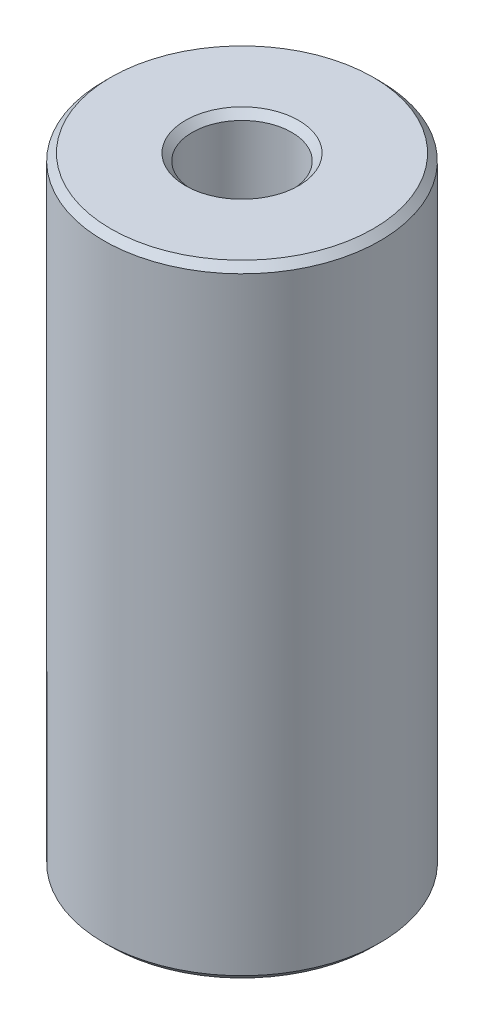
ISO-10303-21;
HEADER;
FILE_DESCRIPTION(('STEP AP214'),'2;1');
FILE_NAME('part.step','',(''),(''),'','','');
FILE_SCHEMA(('AUTOMOTIVE_DESIGN { 1 0 10303 214 1 1 1 1 }'));
ENDSEC;
DATA;
#1=APPLICATION_CONTEXT('core data for automotive mechanical design processes');
#2=APPLICATION_PROTOCOL_DEFINITION('international standard','automotive_design',2000,#1);
#3=PRODUCT_CONTEXT('',#1,'mechanical');
#4=PRODUCT('Part','Part','',(#3));
#5=PRODUCT_RELATED_PRODUCT_CATEGORY('part','',(#4));
#6=PRODUCT_DEFINITION_FORMATION('','',#4);
#7=PRODUCT_DEFINITION_CONTEXT('part definition',#1,'design');
#8=PRODUCT_DEFINITION('design','',#6,#7);
#9=PRODUCT_DEFINITION_SHAPE('','',#8);
#10=(LENGTH_UNIT() NAMED_UNIT(*) SI_UNIT(.MILLI.,.METRE.));
#11=(NAMED_UNIT(*) PLANE_ANGLE_UNIT() SI_UNIT($,.RADIAN.));
#12=(NAMED_UNIT(*) SI_UNIT($,.STERADIAN.) SOLID_ANGLE_UNIT());
#13=UNCERTAINTY_MEASURE_WITH_UNIT(LENGTH_MEASURE(1.E-05),#10,'distance_accuracy_value','');
#14=(GEOMETRIC_REPRESENTATION_CONTEXT(3) GLOBAL_UNCERTAINTY_ASSIGNED_CONTEXT((#13)) GLOBAL_UNIT_ASSIGNED_CONTEXT((#10,
#11,#12)) REPRESENTATION_CONTEXT('',''));
#15=CARTESIAN_POINT('',(0.,0.,0.));
#16=DIRECTION('',(0.,0.,1.));
#17=DIRECTION('',(1.,0.,0.));
#18=AXIS2_PLACEMENT_3D('',#15,#16,#17);
#19=CARTESIAN_POINT('',(0.,45.,0.));
#20=DIRECTION('',(0.,1.,0.));
#21=DIRECTION('',(0.,0.,1.));
#22=AXIS2_PLACEMENT_3D('',#19,#20,#21);
#23=PLANE('',#22);
#24=CARTESIAN_POINT('',(0.,45.,0.));
#25=DIRECTION('',(0.,1.,0.));
#26=DIRECTION('',(0.,0.,1.));
#27=AXIS2_PLACEMENT_3D('',#24,#25,#26);
#28=CIRCLE('',#27,4.10000000000003);
#29=CARTESIAN_POINT('',(0.,45.,4.10000000000003));
#30=VERTEX_POINT('',#29);
#31=EDGE_CURVE('E53',#30,#30,#28,.F.);
#32=ORIENTED_EDGE('',*,*,#31,.T.);
#33=EDGE_LOOP('',(#32));
#34=FACE_BOUND('',#33,.T.);
#35=CARTESIAN_POINT('',(0.,45.,0.));
#36=DIRECTION('',(0.,1.,0.));
#37=DIRECTION('',(0.,0.,1.));
#38=AXIS2_PLACEMENT_3D('',#35,#36,#37);
#39=CIRCLE('',#38,9.50000000000003);
#40=CARTESIAN_POINT('',(0.,45.,9.50000000000003));
#41=VERTEX_POINT('',#40);
#42=EDGE_CURVE('E57',#41,#41,#39,.T.);
#43=ORIENTED_EDGE('',*,*,#42,.T.);
#44=EDGE_LOOP('',(#43));
#45=FACE_BOUND('',#44,.T.);
#46=ADVANCED_FACE('F41',(#34,#45),#23,.T.);
#47=CARTESIAN_POINT('',(0.,0.,0.));
#48=DIRECTION('',(0.,1.,0.));
#49=DIRECTION('',(0.,0.,1.));
#50=AXIS2_PLACEMENT_3D('',#47,#48,#49);
#51=PLANE('',#50);
#52=CARTESIAN_POINT('',(0.,0.,0.));
#53=DIRECTION('',(0.,1.,0.));
#54=DIRECTION('',(0.,0.,1.));
#55=AXIS2_PLACEMENT_3D('',#52,#53,#54);
#56=CIRCLE('',#55,4.09999999999999);
#57=CARTESIAN_POINT('',(0.,0.,4.09999999999999));
#58=VERTEX_POINT('',#57);
#59=EDGE_CURVE('E68',#58,#58,#56,.T.);
#60=ORIENTED_EDGE('',*,*,#59,.T.);
#61=EDGE_LOOP('',(#60));
#62=FACE_BOUND('',#61,.T.);
#63=CARTESIAN_POINT('',(0.,0.,0.));
#64=DIRECTION('',(0.,1.,0.));
#65=DIRECTION('',(0.,0.,1.));
#66=AXIS2_PLACEMENT_3D('',#63,#64,#65);
#67=CIRCLE('',#66,9.49999999999996);
#68=CARTESIAN_POINT('',(0.,0.,9.49999999999996));
#69=VERTEX_POINT('',#68);
#70=EDGE_CURVE('E71',#69,#69,#67,.F.);
#71=ORIENTED_EDGE('',*,*,#70,.T.);
#72=EDGE_LOOP('',(#71));
#73=FACE_BOUND('',#72,.T.);
#74=ADVANCED_FACE('F75',(#62,#73),#51,.F.);
#75=CARTESIAN_POINT('',(0.,45.,0.));
#76=DIRECTION('',(0.,-1.,0.));
#77=DIRECTION('',(0.,0.,-1.));
#78=AXIS2_PLACEMENT_3D('',#75,#76,#77);
#79=CYLINDRICAL_SURFACE('',#78,10.);
#80=CARTESIAN_POINT('',(0.,44.5,0.));
#81=DIRECTION('',(0.,1.,0.));
#82=DIRECTION('',(0.,0.,1.));
#83=AXIS2_PLACEMENT_3D('',#80,#81,#82);
#84=CIRCLE('',#83,10.);
#85=CARTESIAN_POINT('',(0.,44.5,-10.));
#86=VERTEX_POINT('',#85);
#87=EDGE_CURVE('E10',#86,#86,#84,.F.);
#88=CARTESIAN_POINT('',(0.,0.500000000000035,0.));
#89=DIRECTION('',(0.,1.,0.));
#90=DIRECTION('',(0.,0.,1.));
#91=AXIS2_PLACEMENT_3D('',#88,#89,#90);
#92=CIRCLE('',#91,10.);
#93=CARTESIAN_POINT('',(0.,0.500000000000035,-10.));
#94=VERTEX_POINT('',#93);
#95=EDGE_CURVE('E49',#94,#94,#92,.T.);
#96=CARTESIAN_POINT('',(0.,44.5,-10.));
#97=CARTESIAN_POINT('',(0.,44.0416666666667,-10.));
#98=CARTESIAN_POINT('',(0.,43.5833333333334,-10.));
#99=CARTESIAN_POINT('',(0.,42.6666666666667,-10.));
#100=CARTESIAN_POINT('',(0.,42.2083333333334,-10.));
#101=CARTESIAN_POINT('',(0.,41.2916666666667,-10.));
#102=CARTESIAN_POINT('',(0.,40.8333333333334,-10.));
#103=CARTESIAN_POINT('',(0.,39.9166666666667,-10.));
#104=CARTESIAN_POINT('',(0.,39.4583333333334,-10.));
#105=CARTESIAN_POINT('',(0.,38.5416666666667,-10.));
#106=CARTESIAN_POINT('',(0.,38.0833333333334,-10.));
#107=CARTESIAN_POINT('',(0.,37.1666666666667,-10.));
#108=CARTESIAN_POINT('',(0.,36.7083333333334,-10.));
#109=CARTESIAN_POINT('',(0.,35.7916666666667,-10.));
#110=CARTESIAN_POINT('',(0.,35.3333333333334,-10.));
#111=CARTESIAN_POINT('',(0.,34.4166666666667,-10.));
#112=CARTESIAN_POINT('',(0.,33.9583333333334,-10.));
#113=CARTESIAN_POINT('',(0.,33.0416666666667,-10.));
#114=CARTESIAN_POINT('',(0.,32.5833333333334,-10.));
#115=CARTESIAN_POINT('',(0.,31.6666666666667,-10.));
#116=CARTESIAN_POINT('',(0.,31.2083333333334,-10.));
#117=CARTESIAN_POINT('',(0.,30.2916666666667,-10.));
#118=CARTESIAN_POINT('',(0.,29.8333333333334,-10.));
#119=CARTESIAN_POINT('',(0.,28.9166666666667,-10.));
#120=CARTESIAN_POINT('',(0.,28.4583333333334,-10.));
#121=CARTESIAN_POINT('',(0.,27.5416666666667,-10.));
#122=CARTESIAN_POINT('',(0.,27.0833333333334,-10.));
#123=CARTESIAN_POINT('',(0.,26.1666666666667,-10.));
#124=CARTESIAN_POINT('',(0.,25.7083333333334,-10.));
#125=CARTESIAN_POINT('',(0.,24.7916666666667,-10.));
#126=CARTESIAN_POINT('',(0.,24.3333333333334,-10.));
#127=CARTESIAN_POINT('',(0.,23.4166666666667,-10.));
#128=CARTESIAN_POINT('',(0.,22.9583333333334,-10.));
#129=CARTESIAN_POINT('',(0.,22.0416666666667,-10.));
#130=CARTESIAN_POINT('',(0.,21.5833333333334,-10.));
#131=CARTESIAN_POINT('',(0.,20.6666666666667,-10.));
#132=CARTESIAN_POINT('',(0.,20.2083333333334,-10.));
#133=CARTESIAN_POINT('',(0.,19.2916666666667,-10.));
#134=CARTESIAN_POINT('',(0.,18.8333333333334,-10.));
#135=CARTESIAN_POINT('',(0.,17.9166666666667,-10.));
#136=CARTESIAN_POINT('',(0.,17.4583333333334,-10.));
#137=CARTESIAN_POINT('',(0.,16.5416666666667,-10.));
#138=CARTESIAN_POINT('',(0.,16.0833333333334,-10.));
#139=CARTESIAN_POINT('',(0.,15.1666666666667,-10.));
#140=CARTESIAN_POINT('',(0.,14.7083333333334,-10.));
#141=CARTESIAN_POINT('',(0.,13.7916666666667,-10.));
#142=CARTESIAN_POINT('',(0.,13.3333333333334,-10.));
#143=CARTESIAN_POINT('',(0.,12.4166666666667,-10.));
#144=CARTESIAN_POINT('',(0.,11.9583333333334,-10.));
#145=CARTESIAN_POINT('',(0.,11.0416666666667,-10.));
#146=CARTESIAN_POINT('',(0.,10.5833333333334,-10.));
#147=CARTESIAN_POINT('',(0.,9.66666666666671,-10.));
#148=CARTESIAN_POINT('',(0.,9.20833333333337,-10.));
#149=CARTESIAN_POINT('',(0.,8.29166666666671,-10.));
#150=CARTESIAN_POINT('',(0.,7.83333333333337,-10.));
#151=CARTESIAN_POINT('',(0.,6.91666666666671,-10.));
#152=CARTESIAN_POINT('',(0.,6.45833333333337,-10.));
#153=CARTESIAN_POINT('',(0.,5.54166666666671,-10.));
#154=CARTESIAN_POINT('',(0.,5.08333333333337,-10.));
#155=CARTESIAN_POINT('',(0.,4.16666666666671,-10.));
#156=CARTESIAN_POINT('',(0.,3.70833333333337,-10.));
#157=CARTESIAN_POINT('',(0.,2.7916666666667,-10.));
#158=CARTESIAN_POINT('',(0.,2.33333333333337,-10.));
#159=CARTESIAN_POINT('',(0.,1.4166666666667,-10.));
#160=CARTESIAN_POINT('',(0.,0.958333333333369,-10.));
#161=CARTESIAN_POINT('',(0.,0.500000000000035,-10.));
#162=B_SPLINE_CURVE_WITH_KNOTS('',3,(#96,#97,#98,#99,#100,#101,#102,#103,#104,#105,#106,#107,
#108,#109,#110,#111,#112,#113,#114,#115,#116,#117,#118,#119,#120,#121,#122,#123,#124,#125,#126,
#127,#128,#129,#130,#131,#132,#133,#134,#135,#136,#137,#138,#139,#140,#141,#142,#143,#144,#145,
#146,#147,#148,#149,#150,#151,#152,#153,#154,#155,#156,#157,#158,#159,#160,#161),.UNSPECIFIED.,
.F.,.F.,(4,2,2,2,2,2,2,2,2,2,2,2,2,2,2,2,2,2,2,2,2,2,2,2,2,2,2,2,2,2,2,2,4),(0.,1.375,2.75,
4.125,5.50000000000001,6.875,8.25,9.625,11.,12.375,13.75,15.125,16.5,17.875,19.25,20.625,22.,
23.375,24.75,26.125,27.5,28.875,30.25,31.625,33.,34.375,35.75,37.125,38.5,39.875,41.25,42.625,
44.),.UNSPECIFIED.);
#163=EDGE_CURVE('BSEAM91',#86,#94,#162,.T.);
#164=ORIENTED_EDGE('',*,*,#87,.T.);
#165=ORIENTED_EDGE('',*,*,#95,.T.);
#166=ORIENTED_EDGE('',*,*,#163,.T.);
#167=ORIENTED_EDGE('',*,*,#163,.F.);
#168=EDGE_LOOP('',(#164,#166,#165,#167));
#169=FACE_BOUND('',#168,.T.);
#170=ADVANCED_FACE('F91',(#169),#79,.T.);
#171=CARTESIAN_POINT('',(0.,45.,0.));
#172=DIRECTION('',(0.,-1.,0.));
#173=DIRECTION('',(0.,0.,-1.));
#174=AXIS2_PLACEMENT_3D('',#171,#172,#173);
#175=CYLINDRICAL_SURFACE('',#174,3.6);
#176=CARTESIAN_POINT('',(0.,0.499999999999994,0.));
#177=DIRECTION('',(0.,1.,0.));
#178=DIRECTION('',(0.,0.,1.));
#179=AXIS2_PLACEMENT_3D('',#176,#177,#178);
#180=CIRCLE('',#179,3.6);
#181=CARTESIAN_POINT('',(0.,0.499999999999994,-3.6));
#182=VERTEX_POINT('',#181);
#183=EDGE_CURVE('E62',#182,#182,#180,.F.);
#184=CARTESIAN_POINT('',(0.,44.5,0.));
#185=DIRECTION('',(0.,1.,0.));
#186=DIRECTION('',(0.,0.,1.));
#187=AXIS2_PLACEMENT_3D('',#184,#185,#186);
#188=CIRCLE('',#187,3.6);
#189=CARTESIAN_POINT('',(0.,44.5,-3.6));
#190=VERTEX_POINT('',#189);
#191=EDGE_CURVE('E65',#190,#190,#188,.T.);
#192=CARTESIAN_POINT('',(0.,0.499999999999994,-3.6));
#193=CARTESIAN_POINT('',(0.,0.958333333333328,-3.6));
#194=CARTESIAN_POINT('',(0.,1.41666666666666,-3.6));
#195=CARTESIAN_POINT('',(0.,2.33333333333333,-3.6));
#196=CARTESIAN_POINT('',(0.,2.79166666666666,-3.6));
#197=CARTESIAN_POINT('',(0.,3.70833333333332,-3.6));
#198=CARTESIAN_POINT('',(0.,4.16666666666666,-3.6));
#199=CARTESIAN_POINT('',(0.,5.08333333333332,-3.6));
#200=CARTESIAN_POINT('',(0.,5.54166666666666,-3.6));
#201=CARTESIAN_POINT('',(0.,6.45833333333332,-3.6));
#202=CARTESIAN_POINT('',(0.,6.91666666666665,-3.6));
#203=CARTESIAN_POINT('',(0.,7.83333333333332,-3.6));
#204=CARTESIAN_POINT('',(0.,8.29166666666665,-3.6));
#205=CARTESIAN_POINT('',(0.,9.20833333333332,-3.6));
#206=CARTESIAN_POINT('',(0.,9.66666666666666,-3.6));
#207=CARTESIAN_POINT('',(0.,10.5833333333333,-3.6));
#208=CARTESIAN_POINT('',(0.,11.0416666666667,-3.6));
#209=CARTESIAN_POINT('',(0.,11.9583333333333,-3.6));
#210=CARTESIAN_POINT('',(0.,12.4166666666667,-3.6));
#211=CARTESIAN_POINT('',(0.,13.3333333333333,-3.6));
#212=CARTESIAN_POINT('',(0.,13.7916666666666,-3.6));
#213=CARTESIAN_POINT('',(0.,14.7083333333333,-3.6));
#214=CARTESIAN_POINT('',(0.,15.1666666666666,-3.6));
#215=CARTESIAN_POINT('',(0.,16.0833333333333,-3.6));
#216=CARTESIAN_POINT('',(0.,16.5416666666666,-3.6));
#217=CARTESIAN_POINT('',(0.,17.4583333333333,-3.6));
#218=CARTESIAN_POINT('',(0.,17.9166666666666,-3.6));
#219=CARTESIAN_POINT('',(0.,18.8333333333333,-3.6));
#220=CARTESIAN_POINT('',(0.,19.2916666666666,-3.6));
#221=CARTESIAN_POINT('',(0.,20.2083333333333,-3.6));
#222=CARTESIAN_POINT('',(0.,20.6666666666666,-3.6));
#223=CARTESIAN_POINT('',(0.,21.5833333333333,-3.6));
#224=CARTESIAN_POINT('',(0.,22.0416666666666,-3.6));
#225=CARTESIAN_POINT('',(0.,22.9583333333333,-3.6));
#226=CARTESIAN_POINT('',(0.,23.4166666666666,-3.6));
#227=CARTESIAN_POINT('',(0.,24.3333333333333,-3.6));
#228=CARTESIAN_POINT('',(0.,24.7916666666666,-3.6));
#229=CARTESIAN_POINT('',(0.,25.7083333333333,-3.6));
#230=CARTESIAN_POINT('',(0.,26.1666666666666,-3.6));
#231=CARTESIAN_POINT('',(0.,27.0833333333333,-3.6));
#232=CARTESIAN_POINT('',(0.,27.5416666666666,-3.6));
#233=CARTESIAN_POINT('',(0.,28.4583333333333,-3.6));
#234=CARTESIAN_POINT('',(0.,28.9166666666666,-3.6));
#235=CARTESIAN_POINT('',(0.,29.8333333333333,-3.6));
#236=CARTESIAN_POINT('',(0.,30.2916666666666,-3.6));
#237=CARTESIAN_POINT('',(0.,31.2083333333333,-3.6));
#238=CARTESIAN_POINT('',(0.,31.6666666666666,-3.6));
#239=CARTESIAN_POINT('',(0.,32.5833333333333,-3.6));
#240=CARTESIAN_POINT('',(0.,33.0416666666666,-3.6));
#241=CARTESIAN_POINT('',(0.,33.9583333333333,-3.6));
#242=CARTESIAN_POINT('',(0.,34.4166666666666,-3.6));
#243=CARTESIAN_POINT('',(0.,35.3333333333333,-3.6));
#244=CARTESIAN_POINT('',(0.,35.7916666666666,-3.6));
#245=CARTESIAN_POINT('',(0.,36.7083333333333,-3.6));
#246=CARTESIAN_POINT('',(0.,37.1666666666666,-3.6));
#247=CARTESIAN_POINT('',(0.,38.0833333333333,-3.6));
#248=CARTESIAN_POINT('',(0.,38.5416666666666,-3.6));
#249=CARTESIAN_POINT('',(0.,39.4583333333333,-3.6));
#250=CARTESIAN_POINT('',(0.,39.9166666666666,-3.6));
#251=CARTESIAN_POINT('',(0.,40.8333333333333,-3.6));
#252=CARTESIAN_POINT('',(0.,41.2916666666666,-3.6));
#253=CARTESIAN_POINT('',(0.,42.2083333333333,-3.6));
#254=CARTESIAN_POINT('',(0.,42.6666666666666,-3.6));
#255=CARTESIAN_POINT('',(0.,43.5833333333333,-3.6));
#256=CARTESIAN_POINT('',(0.,44.0416666666666,-3.6));
#257=CARTESIAN_POINT('',(0.,44.5,-3.6));
#258=B_SPLINE_CURVE_WITH_KNOTS('',3,(#192,#193,#194,#195,#196,#197,#198,#199,#200,#201,#202,
#203,#204,#205,#206,#207,#208,#209,#210,#211,#212,#213,#214,#215,#216,#217,#218,#219,#220,#221,
#222,#223,#224,#225,#226,#227,#228,#229,#230,#231,#232,#233,#234,#235,#236,#237,#238,#239,#240,
#241,#242,#243,#244,#245,#246,#247,#248,#249,#250,#251,#252,#253,#254,#255,#256,#257),
.UNSPECIFIED.,.F.,.F.,(4,2,2,2,2,2,2,2,2,2,2,2,2,2,2,2,2,2,2,2,2,2,2,2,2,2,2,2,2,2,2,2,4),(0.,
1.375,2.75,4.125,5.5,6.87499999999999,8.24999999999999,9.62499999999999,11.,12.375,13.75,15.125,
16.5,17.875,19.25,20.625,22.,23.375,24.75,26.125,27.5,28.875,30.25,31.625,33.,34.375,35.75,
37.125,38.5,39.875,41.25,42.625,44.),.UNSPECIFIED.);
#259=EDGE_CURVE('BSEAM96',#182,#190,#258,.T.);
#260=ORIENTED_EDGE('',*,*,#183,.T.);
#261=ORIENTED_EDGE('',*,*,#191,.T.);
#262=ORIENTED_EDGE('',*,*,#259,.T.);
#263=ORIENTED_EDGE('',*,*,#259,.F.);
#264=EDGE_LOOP('',(#260,#262,#261,#263));
#265=FACE_BOUND('',#264,.T.);
#266=ADVANCED_FACE('F96',(#265),#175,.F.);
#267=CARTESIAN_POINT('',(0.,0.,0.));
#268=DIRECTION('',(0.,-1.,0.));
#269=DIRECTION('',(0.,0.,-1.));
#270=AXIS2_PLACEMENT_3D('',#267,#268,#269);
#271=CONICAL_SURFACE('',#270,4.09999999999999,0.785398163397447);
#272=ORIENTED_EDGE('',*,*,#183,.F.);
#273=EDGE_LOOP('',(#272));
#274=FACE_BOUND('',#273,.T.);
#275=ORIENTED_EDGE('',*,*,#59,.F.);
#276=EDGE_LOOP('',(#275));
#277=FACE_BOUND('',#276,.T.);
#278=ADVANCED_FACE('F101',(#274,#277),#271,.F.);
#279=CARTESIAN_POINT('',(0.,44.5,0.));
#280=DIRECTION('',(0.,1.,0.));
#281=DIRECTION('',(0.,0.,1.));
#282=AXIS2_PLACEMENT_3D('',#279,#280,#281);
#283=CONICAL_SURFACE('',#282,3.6,0.785398163397447);
#284=ORIENTED_EDGE('',*,*,#31,.F.);
#285=EDGE_LOOP('',(#284));
#286=FACE_BOUND('',#285,.T.);
#287=ORIENTED_EDGE('',*,*,#191,.F.);
#288=EDGE_LOOP('',(#287));
#289=FACE_BOUND('',#288,.T.);
#290=ADVANCED_FACE('F83',(#286,#289),#283,.F.);
#291=CARTESIAN_POINT('',(0.,45.,0.));
#292=DIRECTION('',(0.,-1.,0.));
#293=DIRECTION('',(0.,0.,-1.));
#294=AXIS2_PLACEMENT_3D('',#291,#292,#293);
#295=CONICAL_SURFACE('',#294,9.50000000000003,0.785398163397448);
#296=ORIENTED_EDGE('',*,*,#87,.F.);
#297=EDGE_LOOP('',(#296));
#298=FACE_BOUND('',#297,.T.);
#299=ORIENTED_EDGE('',*,*,#42,.F.);
#300=EDGE_LOOP('',(#299));
#301=FACE_BOUND('',#300,.T.);
#302=ADVANCED_FACE('F79',(#298,#301),#295,.T.);
#303=CARTESIAN_POINT('',(0.,0.500000000000035,0.));
#304=DIRECTION('',(0.,1.,0.));
#305=DIRECTION('',(0.,0.,1.));
#306=AXIS2_PLACEMENT_3D('',#303,#304,#305);
#307=CONICAL_SURFACE('',#306,10.,0.785398163397455);
#308=ORIENTED_EDGE('',*,*,#70,.F.);
#309=EDGE_LOOP('',(#308));
#310=FACE_BOUND('',#309,.T.);
#311=ORIENTED_EDGE('',*,*,#95,.F.);
#312=EDGE_LOOP('',(#311));
#313=FACE_BOUND('',#312,.T.);
#314=ADVANCED_FACE('F44',(#310,#313),#307,.T.);
#315=CLOSED_SHELL('',(#46,#74,#170,#266,#278,#290,#302,#314));
#316=MANIFOLD_SOLID_BREP('B2',#315);
#317=ADVANCED_BREP_SHAPE_REPRESENTATION('',(#18,#316),#14);
#318=SHAPE_DEFINITION_REPRESENTATION(#9,#317);
ENDSEC;
END-ISO-10303-21;
